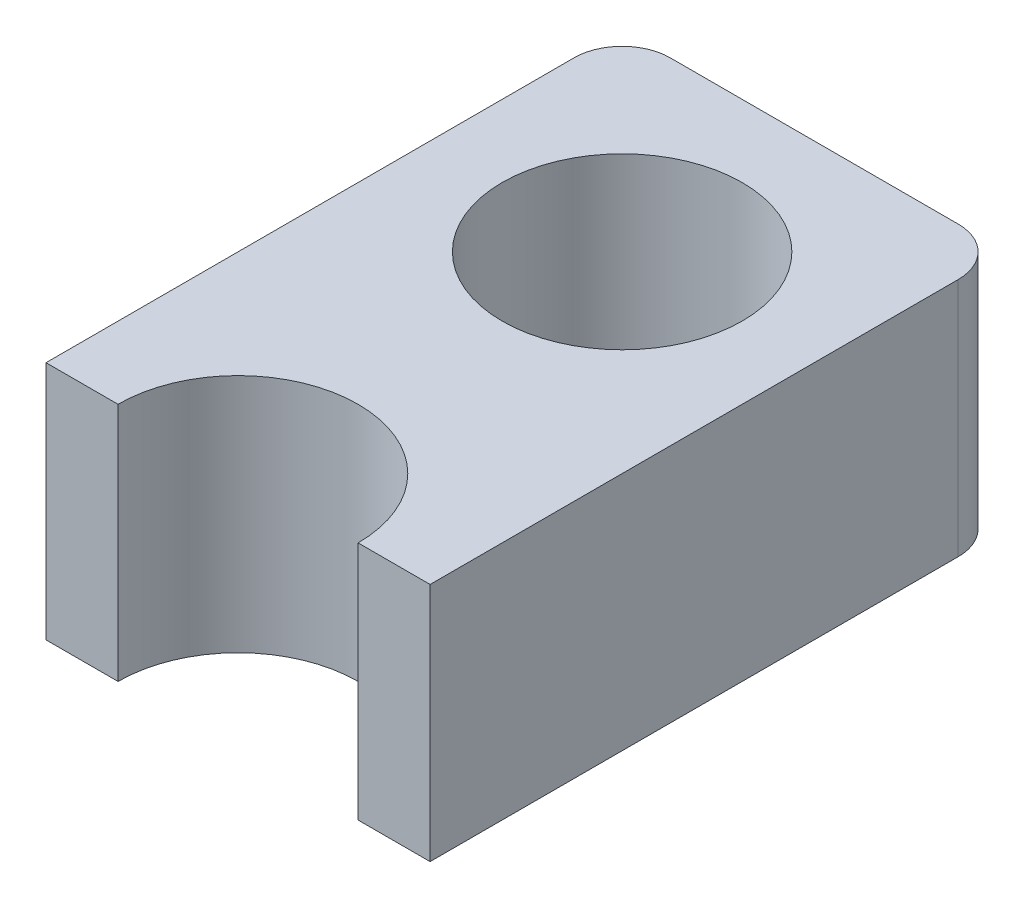
ISO-10303-21;
HEADER;
FILE_DESCRIPTION(('STEP AP214'),'2;1');
FILE_NAME('part.step','',(''),(''),'','','');
FILE_SCHEMA(('AUTOMOTIVE_DESIGN { 1 0 10303 214 1 1 1 1 }'));
ENDSEC;
DATA;
#1=APPLICATION_CONTEXT('core data for automotive mechanical design processes');
#2=APPLICATION_PROTOCOL_DEFINITION('international standard','automotive_design',2000,#1);
#3=PRODUCT_CONTEXT('',#1,'mechanical');
#4=PRODUCT('Part','Part','',(#3));
#5=PRODUCT_RELATED_PRODUCT_CATEGORY('part','',(#4));
#6=PRODUCT_DEFINITION_FORMATION('','',#4);
#7=PRODUCT_DEFINITION_CONTEXT('part definition',#1,'design');
#8=PRODUCT_DEFINITION('design','',#6,#7);
#9=PRODUCT_DEFINITION_SHAPE('','',#8);
#10=(LENGTH_UNIT() NAMED_UNIT(*) SI_UNIT(.MILLI.,.METRE.));
#11=(NAMED_UNIT(*) PLANE_ANGLE_UNIT() SI_UNIT($,.RADIAN.));
#12=(NAMED_UNIT(*) SI_UNIT($,.STERADIAN.) SOLID_ANGLE_UNIT());
#13=UNCERTAINTY_MEASURE_WITH_UNIT(LENGTH_MEASURE(1.E-05),#10,'distance_accuracy_value','');
#14=(GEOMETRIC_REPRESENTATION_CONTEXT(3) GLOBAL_UNCERTAINTY_ASSIGNED_CONTEXT((#13)) GLOBAL_UNIT_ASSIGNED_CONTEXT((#10,
#11,#12)) REPRESENTATION_CONTEXT('',''));
#15=CARTESIAN_POINT('',(0.,0.,0.));
#16=DIRECTION('',(0.,0.,1.));
#17=DIRECTION('',(1.,0.,0.));
#18=AXIS2_PLACEMENT_3D('',#15,#16,#17);
#19=CARTESIAN_POINT('',(10.5,0.5,0.));
#20=DIRECTION('',(0.,-1.,0.));
#21=DIRECTION('',(0.,0.,-1.));
#22=AXIS2_PLACEMENT_3D('',#19,#20,#21);
#23=CYLINDRICAL_SURFACE('',#22,0.5);
#24=DIRECTION('',(0.,1.,0.));
#25=VECTOR('',#24,1.);
#26=CARTESIAN_POINT('',(10.,0.5,0.));
#27=LINE('',#26,#25);
#28=CARTESIAN_POINT('',(10.,-0.500000044703484,0.));
#29=VERTEX_POINT('',#28);
#30=CARTESIAN_POINT('',(10.,0.5,0.));
#31=VERTEX_POINT('',#30);
#32=EDGE_CURVE('E77',#29,#31,#27,.T.);
#33=ORIENTED_EDGE('',*,*,#32,.F.);
#34=CARTESIAN_POINT('',(10.5,-0.500000044703484,0.));
#35=DIRECTION('',(0.,-1.,0.));
#36=DIRECTION('',(0.,0.,-1.));
#37=AXIS2_PLACEMENT_3D('',#34,#35,#36);
#38=CIRCLE('',#37,0.5);
#39=CARTESIAN_POINT('',(11.,-0.500000044703484,0.));
#40=VERTEX_POINT('',#39);
#41=EDGE_CURVE('E92',#29,#40,#38,.T.);
#42=ORIENTED_EDGE('',*,*,#41,.T.);
#43=DIRECTION('',(0.,1.,0.));
#44=VECTOR('',#43,1.);
#45=CARTESIAN_POINT('',(11.,0.5,0.));
#46=LINE('',#45,#44);
#47=CARTESIAN_POINT('',(11.,0.5,0.));
#48=VERTEX_POINT('',#47);
#49=EDGE_CURVE('E91',#48,#40,#46,.F.);
#50=ORIENTED_EDGE('',*,*,#49,.F.);
#51=CARTESIAN_POINT('',(10.5,0.5,0.));
#52=DIRECTION('',(0.,-1.,0.));
#53=DIRECTION('',(0.,0.,-1.));
#54=AXIS2_PLACEMENT_3D('',#51,#52,#53);
#55=CIRCLE('',#54,0.5);
#56=EDGE_CURVE('E20',#31,#48,#55,.T.);
#57=ORIENTED_EDGE('',*,*,#56,.F.);
#58=EDGE_LOOP('',(#33,#42,#50,#57));
#59=FACE_BOUND('',#58,.T.);
#60=ADVANCED_FACE('F17',(#59),#23,.F.);
#61=CARTESIAN_POINT('',(11.3,0.5,0.));
#62=DIRECTION('',(0.,0.,1.));
#63=DIRECTION('',(1.,0.,0.));
#64=AXIS2_PLACEMENT_3D('',#61,#62,#63);
#65=PLANE('',#64);
#66=DIRECTION('',(1.,0.,0.));
#67=VECTOR('',#66,1.);
#68=CARTESIAN_POINT('',(20.5,-0.500000044703484,0.));
#69=LINE('',#68,#67);
#70=CARTESIAN_POINT('',(11.3,-0.500000044703484,0.));
#71=VERTEX_POINT('',#70);
#72=EDGE_CURVE('E140',#40,#71,#69,.T.);
#73=ORIENTED_EDGE('',*,*,#72,.T.);
#74=DIRECTION('',(0.,1.,0.));
#75=VECTOR('',#74,1.);
#76=CARTESIAN_POINT('',(11.3,0.5,0.));
#77=LINE('',#76,#75);
#78=CARTESIAN_POINT('',(11.3,0.5,0.));
#79=VERTEX_POINT('',#78);
#80=EDGE_CURVE('E96',#79,#71,#77,.F.);
#81=ORIENTED_EDGE('',*,*,#80,.F.);
#82=DIRECTION('',(1.,0.,0.));
#83=VECTOR('',#82,1.);
#84=CARTESIAN_POINT('',(20.5,0.5,0.));
#85=LINE('',#84,#83);
#86=EDGE_CURVE('E85',#48,#79,#85,.T.);
#87=ORIENTED_EDGE('',*,*,#86,.F.);
#88=ORIENTED_EDGE('',*,*,#49,.T.);
#89=EDGE_LOOP('',(#73,#81,#87,#88));
#90=FACE_BOUND('',#89,.T.);
#91=ADVANCED_FACE('F98',(#90),#65,.T.);
#92=CARTESIAN_POINT('',(11.3,0.5,-2.2));
#93=DIRECTION('',(1.,0.,0.));
#94=DIRECTION('',(0.,0.,-1.));
#95=AXIS2_PLACEMENT_3D('',#92,#93,#94);
#96=PLANE('',#95);
#97=DIRECTION('',(0.,0.,1.));
#98=VECTOR('',#97,1.);
#99=CARTESIAN_POINT('',(11.3,-0.500000044703484,-0.5));
#100=LINE('',#99,#98);
#101=CARTESIAN_POINT('',(11.3,-0.500000044703484,-2.20000007470752));
#102=VERTEX_POINT('',#101);
#103=EDGE_CURVE('E138',#71,#102,#100,.F.);
#104=ORIENTED_EDGE('',*,*,#103,.T.);
#105=DIRECTION('',(0.,-1.,0.));
#106=VECTOR('',#105,1.);
#107=CARTESIAN_POINT('',(11.3,0.5,-2.2));
#108=LINE('',#107,#106);
#109=CARTESIAN_POINT('',(11.3,0.5,-2.20000007470752));
#110=VERTEX_POINT('',#109);
#111=EDGE_CURVE('E122',#110,#102,#108,.T.);
#112=ORIENTED_EDGE('',*,*,#111,.F.);
#113=DIRECTION('',(0.,0.,1.));
#114=VECTOR('',#113,1.);
#115=CARTESIAN_POINT('',(11.3,0.5,-0.5));
#116=LINE('',#115,#114);
#117=EDGE_CURVE('E100',#79,#110,#116,.F.);
#118=ORIENTED_EDGE('',*,*,#117,.F.);
#119=ORIENTED_EDGE('',*,*,#80,.T.);
#120=EDGE_LOOP('',(#104,#112,#118,#119));
#121=FACE_BOUND('',#120,.T.);
#122=ADVANCED_FACE('F189',(#121),#96,.T.);
#123=CARTESIAN_POINT('',(11.100000149415,0.5,-2.20000014941504));
#124=DIRECTION('',(0.,-1.,0.));
#125=DIRECTION('',(0.,0.,-1.));
#126=AXIS2_PLACEMENT_3D('',#123,#124,#125);
#127=CYLINDRICAL_SURFACE('',#126,0.199999850585019);
#128=CARTESIAN_POINT('',(11.100000149415,-0.500000044703484,-2.20000014941504));
#129=DIRECTION('',(0.,-1.,0.));
#130=DIRECTION('',(0.,0.,-1.));
#131=AXIS2_PLACEMENT_3D('',#128,#129,#130);
#132=CIRCLE('',#131,0.199999850585019);
#133=CARTESIAN_POINT('',(11.1000000747075,-0.500000044703484,-2.4));
#134=VERTEX_POINT('',#133);
#135=EDGE_CURVE('E135',#102,#134,#132,.F.);
#136=ORIENTED_EDGE('',*,*,#135,.T.);
#137=DIRECTION('',(0.,1.,0.));
#138=VECTOR('',#137,1.);
#139=CARTESIAN_POINT('',(11.1,0.5,-2.4));
#140=LINE('',#139,#138);
#141=CARTESIAN_POINT('',(11.1000000747075,0.5,-2.4));
#142=VERTEX_POINT('',#141);
#143=EDGE_CURVE('E120',#142,#134,#140,.F.);
#144=ORIENTED_EDGE('',*,*,#143,.F.);
#145=CARTESIAN_POINT('',(11.100000149415,0.5,-2.20000014941504));
#146=DIRECTION('',(0.,-1.,0.));
#147=DIRECTION('',(0.,0.,-1.));
#148=AXIS2_PLACEMENT_3D('',#145,#146,#147);
#149=CIRCLE('',#148,0.199999850585019);
#150=EDGE_CURVE('E102',#110,#142,#149,.F.);
#151=ORIENTED_EDGE('',*,*,#150,.F.);
#152=ORIENTED_EDGE('',*,*,#111,.T.);
#153=EDGE_LOOP('',(#136,#144,#151,#152));
#154=FACE_BOUND('',#153,.T.);
#155=ADVANCED_FACE('F185',(#154),#127,.T.);
#156=CARTESIAN_POINT('',(9.9,0.5,-2.4));
#157=DIRECTION('',(0.,0.,-1.));
#158=DIRECTION('',(-1.,0.,0.));
#159=AXIS2_PLACEMENT_3D('',#156,#157,#158);
#160=PLANE('',#159);
#161=DIRECTION('',(1.,0.,0.));
#162=VECTOR('',#161,1.);
#163=CARTESIAN_POINT('',(20.5,-0.500000044703484,-2.4));
#164=LINE('',#163,#162);
#165=CARTESIAN_POINT('',(9.89999985058496,-0.500000044703484,-2.40000000000003));
#166=VERTEX_POINT('',#165);
#167=EDGE_CURVE('E134',#134,#166,#164,.F.);
#168=ORIENTED_EDGE('',*,*,#167,.T.);
#169=DIRECTION('',(0.,-1.,0.));
#170=VECTOR('',#169,1.);
#171=CARTESIAN_POINT('',(9.89999985058496,0.5,-2.40000000000006));
#172=LINE('',#171,#170);
#173=CARTESIAN_POINT('',(9.89999985058496,0.5,-2.40000000000003));
#174=VERTEX_POINT('',#173);
#175=EDGE_CURVE('E118',#174,#166,#172,.T.);
#176=ORIENTED_EDGE('',*,*,#175,.F.);
#177=DIRECTION('',(1.,0.,0.));
#178=VECTOR('',#177,1.);
#179=CARTESIAN_POINT('',(20.5,0.5,-2.4));
#180=LINE('',#179,#178);
#181=EDGE_CURVE('E143',#142,#174,#180,.F.);
#182=ORIENTED_EDGE('',*,*,#181,.F.);
#183=ORIENTED_EDGE('',*,*,#143,.T.);
#184=EDGE_LOOP('',(#168,#176,#182,#183));
#185=FACE_BOUND('',#184,.T.);
#186=ADVANCED_FACE('F183',(#185),#160,.T.);
#187=CARTESIAN_POINT('',(9.89999985058496,0.5,-2.20000014941504));
#188=DIRECTION('',(0.,-1.,0.));
#189=DIRECTION('',(0.,0.,-1.));
#190=AXIS2_PLACEMENT_3D('',#187,#188,#189);
#191=CYLINDRICAL_SURFACE('',#190,0.199999850585019);
#192=CARTESIAN_POINT('',(9.89999985058496,-0.500000044703484,-2.20000014941504));
#193=DIRECTION('',(0.,-1.,0.));
#194=DIRECTION('',(0.,0.,-1.));
#195=AXIS2_PLACEMENT_3D('',#192,#193,#194);
#196=CIRCLE('',#195,0.199999850585019);
#197=CARTESIAN_POINT('',(9.7,-0.500000044703484,-2.20000007470752));
#198=VERTEX_POINT('',#197);
#199=EDGE_CURVE('E130',#166,#198,#196,.F.);
#200=ORIENTED_EDGE('',*,*,#199,.T.);
#201=DIRECTION('',(0.,1.,0.));
#202=VECTOR('',#201,1.);
#203=CARTESIAN_POINT('',(9.7,0.5,-2.2));
#204=LINE('',#203,#202);
#205=CARTESIAN_POINT('',(9.7,0.5,-2.20000007470752));
#206=VERTEX_POINT('',#205);
#207=EDGE_CURVE('E114',#206,#198,#204,.F.);
#208=ORIENTED_EDGE('',*,*,#207,.F.);
#209=CARTESIAN_POINT('',(9.89999985058496,0.5,-2.20000014941504));
#210=DIRECTION('',(0.,-1.,0.));
#211=DIRECTION('',(0.,0.,-1.));
#212=AXIS2_PLACEMENT_3D('',#209,#210,#211);
#213=CIRCLE('',#212,0.199999850585019);
#214=EDGE_CURVE('E142',#174,#206,#213,.F.);
#215=ORIENTED_EDGE('',*,*,#214,.F.);
#216=ORIENTED_EDGE('',*,*,#175,.T.);
#217=EDGE_LOOP('',(#200,#208,#215,#216));
#218=FACE_BOUND('',#217,.T.);
#219=ADVANCED_FACE('F179',(#218),#191,.T.);
#220=CARTESIAN_POINT('',(9.7,0.5,0.));
#221=DIRECTION('',(-1.,0.,0.));
#222=DIRECTION('',(0.,0.,1.));
#223=AXIS2_PLACEMENT_3D('',#220,#221,#222);
#224=PLANE('',#223);
#225=DIRECTION('',(0.,0.,1.));
#226=VECTOR('',#225,1.);
#227=CARTESIAN_POINT('',(9.7,-0.500000044703484,-0.5));
#228=LINE('',#227,#226);
#229=CARTESIAN_POINT('',(9.7,-0.500000044703484,0.));
#230=VERTEX_POINT('',#229);
#231=EDGE_CURVE('E133',#198,#230,#228,.T.);
#232=ORIENTED_EDGE('',*,*,#231,.T.);
#233=DIRECTION('',(0.,1.,0.));
#234=VECTOR('',#233,1.);
#235=CARTESIAN_POINT('',(9.7,0.5,0.));
#236=LINE('',#235,#234);
#237=CARTESIAN_POINT('',(9.7,0.5,0.));
#238=VERTEX_POINT('',#237);
#239=EDGE_CURVE('E35',#238,#230,#236,.F.);
#240=ORIENTED_EDGE('',*,*,#239,.F.);
#241=DIRECTION('',(0.,0.,1.));
#242=VECTOR('',#241,1.);
#243=CARTESIAN_POINT('',(9.7,0.5,-0.5));
#244=LINE('',#243,#242);
#245=EDGE_CURVE('E141',#206,#238,#244,.T.);
#246=ORIENTED_EDGE('',*,*,#245,.F.);
#247=ORIENTED_EDGE('',*,*,#207,.T.);
#248=EDGE_LOOP('',(#232,#240,#246,#247));
#249=FACE_BOUND('',#248,.T.);
#250=ADVANCED_FACE('F174',(#249),#224,.T.);
#251=CARTESIAN_POINT('',(10.,0.5,0.));
#252=DIRECTION('',(0.,0.,1.));
#253=DIRECTION('',(1.,0.,0.));
#254=AXIS2_PLACEMENT_3D('',#251,#252,#253);
#255=PLANE('',#254);
#256=DIRECTION('',(1.,0.,0.));
#257=VECTOR('',#256,1.);
#258=CARTESIAN_POINT('',(20.5,-0.500000044703484,0.));
#259=LINE('',#258,#257);
#260=EDGE_CURVE('E129',#230,#29,#259,.T.);
#261=ORIENTED_EDGE('',*,*,#260,.T.);
#262=ORIENTED_EDGE('',*,*,#32,.T.);
#263=DIRECTION('',(1.,0.,0.));
#264=VECTOR('',#263,1.);
#265=CARTESIAN_POINT('',(20.5,0.5,0.));
#266=LINE('',#265,#264);
#267=EDGE_CURVE('E88',#238,#31,#266,.T.);
#268=ORIENTED_EDGE('',*,*,#267,.F.);
#269=ORIENTED_EDGE('',*,*,#239,.T.);
#270=EDGE_LOOP('',(#261,#262,#268,#269));
#271=FACE_BOUND('',#270,.T.);
#272=ADVANCED_FACE('F168',(#271),#255,.T.);
#273=CARTESIAN_POINT('',(20.5,0.5,-0.5));
#274=DIRECTION('',(0.,1.,0.));
#275=DIRECTION('',(0.,0.,1.));
#276=AXIS2_PLACEMENT_3D('',#273,#274,#275);
#277=PLANE('',#276);
#278=CARTESIAN_POINT('',(10.5,0.5,-1.6));
#279=DIRECTION('',(0.,-1.,0.));
#280=DIRECTION('',(0.,0.,-1.));
#281=AXIS2_PLACEMENT_3D('',#278,#279,#280);
#282=CIRCLE('',#281,0.5);
#283=CARTESIAN_POINT('',(10.5,0.5,-2.1));
#284=VERTEX_POINT('',#283);
#285=EDGE_CURVE('E26',#284,#284,#282,.T.);
#286=ORIENTED_EDGE('',*,*,#285,.T.);
#287=EDGE_LOOP('',(#286));
#288=FACE_BOUND('',#287,.T.);
#289=ORIENTED_EDGE('',*,*,#214,.T.);
#290=ORIENTED_EDGE('',*,*,#245,.T.);
#291=ORIENTED_EDGE('',*,*,#267,.T.);
#292=ORIENTED_EDGE('',*,*,#56,.T.);
#293=ORIENTED_EDGE('',*,*,#86,.T.);
#294=ORIENTED_EDGE('',*,*,#117,.T.);
#295=ORIENTED_EDGE('',*,*,#150,.T.);
#296=ORIENTED_EDGE('',*,*,#181,.T.);
#297=EDGE_LOOP('',(#289,#290,#291,#292,#293,#294,#295,#296));
#298=FACE_BOUND('',#297,.T.);
#299=ADVANCED_FACE('F83',(#288,#298),#277,.T.);
#300=CARTESIAN_POINT('',(20.5,-0.500000044703484,-0.5));
#301=DIRECTION('',(0.,1.,0.));
#302=DIRECTION('',(0.,0.,1.));
#303=AXIS2_PLACEMENT_3D('',#300,#301,#302);
#304=PLANE('',#303);
#305=CARTESIAN_POINT('',(10.5,-0.500000044703484,-1.6));
#306=DIRECTION('',(0.,-1.,0.));
#307=DIRECTION('',(0.,0.,-1.));
#308=AXIS2_PLACEMENT_3D('',#305,#306,#307);
#309=CIRCLE('',#308,0.5);
#310=CARTESIAN_POINT('',(10.5,-0.500000044703484,-2.1));
#311=VERTEX_POINT('',#310);
#312=EDGE_CURVE('E11',#311,#311,#309,.F.);
#313=ORIENTED_EDGE('',*,*,#312,.T.);
#314=EDGE_LOOP('',(#313));
#315=FACE_BOUND('',#314,.T.);
#316=ORIENTED_EDGE('',*,*,#231,.F.);
#317=ORIENTED_EDGE('',*,*,#199,.F.);
#318=ORIENTED_EDGE('',*,*,#167,.F.);
#319=ORIENTED_EDGE('',*,*,#135,.F.);
#320=ORIENTED_EDGE('',*,*,#103,.F.);
#321=ORIENTED_EDGE('',*,*,#72,.F.);
#322=ORIENTED_EDGE('',*,*,#41,.F.);
#323=ORIENTED_EDGE('',*,*,#260,.F.);
#324=EDGE_LOOP('',(#316,#317,#318,#319,#320,#321,#322,#323));
#325=FACE_BOUND('',#324,.T.);
#326=ADVANCED_FACE('F171',(#315,#325),#304,.F.);
#327=CARTESIAN_POINT('',(10.5,0.5,-1.6));
#328=DIRECTION('',(0.,-1.,0.));
#329=DIRECTION('',(0.,0.,-1.));
#330=AXIS2_PLACEMENT_3D('',#327,#328,#329);
#331=CYLINDRICAL_SURFACE('',#330,0.5);
#332=ORIENTED_EDGE('',*,*,#285,.F.);
#333=EDGE_LOOP('',(#332));
#334=FACE_BOUND('',#333,.T.);
#335=ORIENTED_EDGE('',*,*,#312,.F.);
#336=EDGE_LOOP('',(#335));
#337=FACE_BOUND('',#336,.T.);
#338=ADVANCED_FACE('F198',(#334,#337),#331,.F.);
#339=CLOSED_SHELL('',(#60,#91,#122,#155,#186,#219,#250,#272,#299,#326,#338));
#340=MANIFOLD_SOLID_BREP('B1',#339);
#341=ADVANCED_BREP_SHAPE_REPRESENTATION('',(#18,#340),#14);
#342=SHAPE_DEFINITION_REPRESENTATION(#9,#341);
ENDSEC;
END-ISO-10303-21;
